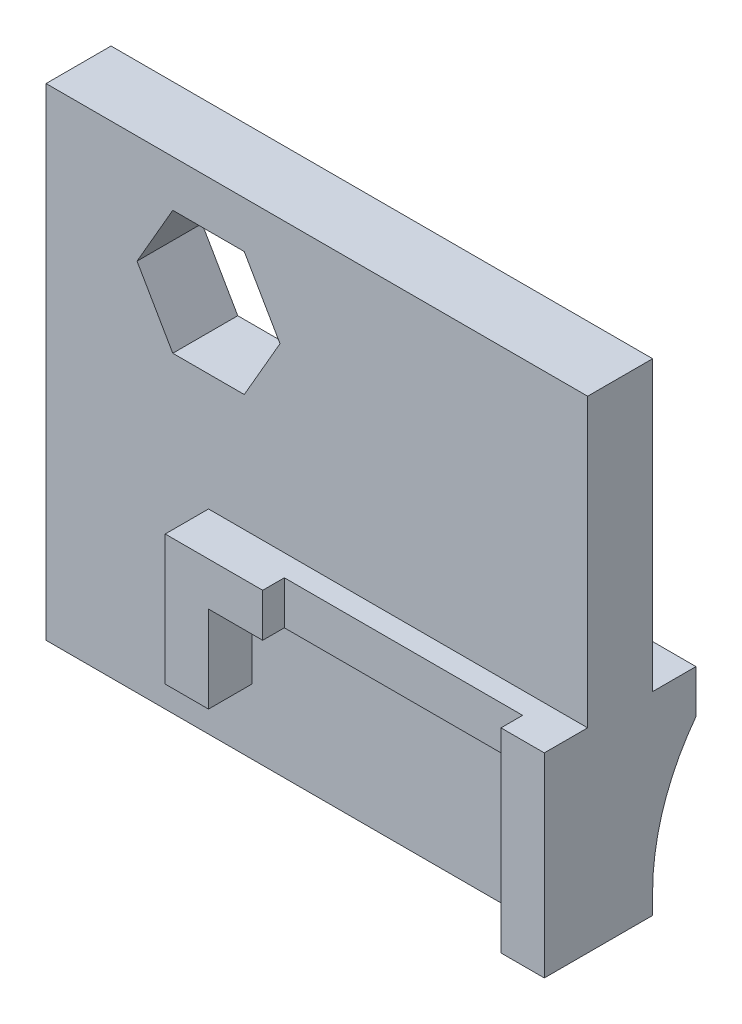
ISO-10303-21;
HEADER;
FILE_DESCRIPTION(('STEP AP214'),'2;1');
FILE_NAME('part.step','',(''),(''),'','','');
FILE_SCHEMA(('AUTOMOTIVE_DESIGN { 1 0 10303 214 1 1 1 1 }'));
ENDSEC;
DATA;
#1=APPLICATION_CONTEXT('core data for automotive mechanical design processes');
#2=APPLICATION_PROTOCOL_DEFINITION('international standard','automotive_design',2000,#1);
#3=PRODUCT_CONTEXT('',#1,'mechanical');
#4=PRODUCT('Part','Part','',(#3));
#5=PRODUCT_RELATED_PRODUCT_CATEGORY('part','',(#4));
#6=PRODUCT_DEFINITION_FORMATION('','',#4);
#7=PRODUCT_DEFINITION_CONTEXT('part definition',#1,'design');
#8=PRODUCT_DEFINITION('design','',#6,#7);
#9=PRODUCT_DEFINITION_SHAPE('','',#8);
#10=(LENGTH_UNIT() NAMED_UNIT(*) SI_UNIT(.MILLI.,.METRE.));
#11=(NAMED_UNIT(*) PLANE_ANGLE_UNIT() SI_UNIT($,.RADIAN.));
#12=(NAMED_UNIT(*) SI_UNIT($,.STERADIAN.) SOLID_ANGLE_UNIT());
#13=UNCERTAINTY_MEASURE_WITH_UNIT(LENGTH_MEASURE(1.E-05),#10,'distance_accuracy_value','');
#14=(GEOMETRIC_REPRESENTATION_CONTEXT(3) GLOBAL_UNCERTAINTY_ASSIGNED_CONTEXT((#13)) GLOBAL_UNIT_ASSIGNED_CONTEXT((#10,
#11,#12)) REPRESENTATION_CONTEXT('',''));
#15=CARTESIAN_POINT('',(0.,0.,0.));
#16=DIRECTION('',(0.,0.,1.));
#17=DIRECTION('',(1.,0.,0.));
#18=AXIS2_PLACEMENT_3D('',#15,#16,#17);
#19=CARTESIAN_POINT('',(0.,0.,5.));
#20=DIRECTION('',(0.,0.,1.));
#21=DIRECTION('',(1.,0.,0.));
#22=AXIS2_PLACEMENT_3D('',#19,#20,#21);
#23=PLANE('',#22);
#24=DIRECTION('',(0.,-1.,0.));
#25=VECTOR('',#24,1.);
#26=CARTESIAN_POINT('',(4.50000000000001,-8.25788383248865,5.));
#27=LINE('',#26,#25);
#28=CARTESIAN_POINT('',(4.50000000000001,-8.25788383248865,5.));
#29=VERTEX_POINT('',#28);
#30=CARTESIAN_POINT('',(4.50000000000001,-10.2578838324887,5.));
#31=VERTEX_POINT('',#30);
#32=EDGE_CURVE('E205',#29,#31,#27,.T.);
#33=ORIENTED_EDGE('',*,*,#32,.F.);
#34=DIRECTION('',(-1.,0.,0.));
#35=VECTOR('',#34,1.);
#36=CARTESIAN_POINT('',(0.,-8.25788383248865,5.));
#37=LINE('',#36,#35);
#38=CARTESIAN_POINT('',(0.,-8.25788383248865,5.));
#39=VERTEX_POINT('',#38);
#40=EDGE_CURVE('E268',#29,#39,#37,.T.);
#41=ORIENTED_EDGE('',*,*,#40,.T.);
#42=DIRECTION('',(0.,-1.,0.));
#43=VECTOR('',#42,1.);
#44=CARTESIAN_POINT('',(0.,-8.25788383248865,5.));
#45=LINE('',#44,#43);
#46=CARTESIAN_POINT('',(0.,-14.2578838324887,5.));
#47=VERTEX_POINT('',#46);
#48=EDGE_CURVE('E244',#39,#47,#45,.T.);
#49=ORIENTED_EDGE('',*,*,#48,.T.);
#50=DIRECTION('',(1.,0.,0.));
#51=VECTOR('',#50,1.);
#52=CARTESIAN_POINT('',(0.,-14.2578838324887,5.));
#53=LINE('',#52,#51);
#54=CARTESIAN_POINT('',(2.00000000000001,-14.2578838324887,5.));
#55=VERTEX_POINT('',#54);
#56=EDGE_CURVE('E248',#47,#55,#53,.T.);
#57=ORIENTED_EDGE('',*,*,#56,.T.);
#58=DIRECTION('',(0.,1.,0.));
#59=VECTOR('',#58,1.);
#60=CARTESIAN_POINT('',(2.00000000000001,-10.2578838324887,5.));
#61=LINE('',#60,#59);
#62=CARTESIAN_POINT('',(2.00000000000001,-10.2578838324887,5.));
#63=VERTEX_POINT('',#62);
#64=EDGE_CURVE('E252',#55,#63,#61,.T.);
#65=ORIENTED_EDGE('',*,*,#64,.T.);
#66=DIRECTION('',(1.,0.,0.));
#67=VECTOR('',#66,1.);
#68=CARTESIAN_POINT('',(2.00000000000001,-10.2578838324887,5.));
#69=LINE('',#68,#67);
#70=EDGE_CURVE('E255',#63,#31,#69,.T.);
#71=ORIENTED_EDGE('',*,*,#70,.T.);
#72=EDGE_LOOP('',(#33,#41,#49,#57,#65,#71));
#73=FACE_BOUND('',#72,.T.);
#74=ADVANCED_FACE('F39',(#73),#23,.T.);
#75=CARTESIAN_POINT('',(0.,0.,0.));
#76=DIRECTION('',(0.,0.,1.));
#77=DIRECTION('',(1.,0.,0.));
#78=AXIS2_PLACEMENT_3D('',#75,#76,#77);
#79=PLANE('',#78);
#80=DIRECTION('',(0.,-1.,0.));
#81=VECTOR('',#80,1.);
#82=CARTESIAN_POINT('',(-7.5,5.,0.));
#83=LINE('',#82,#81);
#84=CARTESIAN_POINT('',(-7.5,-16.3078838324886,0.));
#85=VERTEX_POINT('',#84);
#86=CARTESIAN_POINT('',(-7.5,-17.2578838324886,0.));
#87=VERTEX_POINT('',#86);
#88=EDGE_CURVE('E410',#85,#87,#83,.T.);
#89=ORIENTED_EDGE('',*,*,#88,.F.);
#90=DIRECTION('',(1.,0.,0.));
#91=VECTOR('',#90,1.);
#92=CARTESIAN_POINT('',(0.,-16.3078838324886,0.));
#93=LINE('',#92,#91);
#94=CARTESIAN_POINT('',(17.5,-16.3078838324886,0.));
#95=VERTEX_POINT('',#94);
#96=EDGE_CURVE('E61',#85,#95,#93,.T.);
#97=ORIENTED_EDGE('',*,*,#96,.T.);
#98=DIRECTION('',(0.,1.,0.));
#99=VECTOR('',#98,1.);
#100=CARTESIAN_POINT('',(17.5,5.,0.));
#101=LINE('',#100,#99);
#102=CARTESIAN_POINT('',(17.5,-17.2578838324886,0.));
#103=VERTEX_POINT('',#102);
#104=EDGE_CURVE('E434',#103,#95,#101,.T.);
#105=ORIENTED_EDGE('',*,*,#104,.F.);
#106=DIRECTION('',(1.,0.,0.));
#107=VECTOR('',#106,1.);
#108=CARTESIAN_POINT('',(-7.5,-17.2578838324886,0.));
#109=LINE('',#108,#107);
#110=EDGE_CURVE('E430',#87,#103,#109,.T.);
#111=ORIENTED_EDGE('',*,*,#110,.F.);
#112=EDGE_LOOP('',(#89,#97,#105,#111));
#113=FACE_BOUND('',#112,.T.);
#114=ADVANCED_FACE('F504',(#113),#79,.F.);
#115=DIRECTION('',(1.,0.,0.));
#116=VECTOR('',#115,1.);
#117=CARTESIAN_POINT('',(-1.65,-2.85788383248865,0.));
#118=LINE('',#117,#116);
#119=CARTESIAN_POINT('',(-1.65,-2.85788383248865,0.));
#120=VERTEX_POINT('',#119);
#121=CARTESIAN_POINT('',(1.65,-2.85788383248865,0.));
#122=VERTEX_POINT('',#121);
#123=EDGE_CURVE('E347',#120,#122,#118,.T.);
#124=ORIENTED_EDGE('',*,*,#123,.T.);
#125=DIRECTION('',(0.5,0.866025403784439,0.));
#126=VECTOR('',#125,1.);
#127=CARTESIAN_POINT('',(1.65,-2.85788383248865,0.));
#128=LINE('',#127,#126);
#129=CARTESIAN_POINT('',(3.3,0.,0.));
#130=VERTEX_POINT('',#129);
#131=EDGE_CURVE('E372',#122,#130,#128,.T.);
#132=ORIENTED_EDGE('',*,*,#131,.T.);
#133=DIRECTION('',(-0.5,0.866025403784438,0.));
#134=VECTOR('',#133,1.);
#135=CARTESIAN_POINT('',(3.3,0.,0.));
#136=LINE('',#135,#134);
#137=CARTESIAN_POINT('',(1.65,2.85788383248865,0.));
#138=VERTEX_POINT('',#137);
#139=EDGE_CURVE('E376',#130,#138,#136,.T.);
#140=ORIENTED_EDGE('',*,*,#139,.T.);
#141=DIRECTION('',(-1.,0.,0.));
#142=VECTOR('',#141,1.);
#143=CARTESIAN_POINT('',(1.65,2.85788383248865,0.));
#144=LINE('',#143,#142);
#145=CARTESIAN_POINT('',(-1.65,2.85788383248865,0.));
#146=VERTEX_POINT('',#145);
#147=EDGE_CURVE('E380',#138,#146,#144,.T.);
#148=ORIENTED_EDGE('',*,*,#147,.T.);
#149=DIRECTION('',(-0.5,-0.866025403784439,0.));
#150=VECTOR('',#149,1.);
#151=CARTESIAN_POINT('',(-1.65,2.85788383248865,0.));
#152=LINE('',#151,#150);
#153=CARTESIAN_POINT('',(-3.3,0.,0.));
#154=VERTEX_POINT('',#153);
#155=EDGE_CURVE('E384',#146,#154,#152,.T.);
#156=ORIENTED_EDGE('',*,*,#155,.T.);
#157=DIRECTION('',(0.5,-0.866025403784439,0.));
#158=VECTOR('',#157,1.);
#159=CARTESIAN_POINT('',(-3.3,0.,0.));
#160=LINE('',#159,#158);
#161=EDGE_CURVE('E352',#154,#120,#160,.T.);
#162=ORIENTED_EDGE('',*,*,#161,.T.);
#163=EDGE_LOOP('',(#124,#132,#140,#148,#156,#162));
#164=FACE_BOUND('',#163,.T.);
#165=DIRECTION('',(1.,0.,0.));
#166=VECTOR('',#165,1.);
#167=CARTESIAN_POINT('',(-7.5,-8.30788383248865,0.));
#168=LINE('',#167,#166);
#169=CARTESIAN_POINT('',(-7.5,-8.30788383248865,0.));
#170=VERTEX_POINT('',#169);
#171=CARTESIAN_POINT('',(17.5,-8.30788383248865,0.));
#172=VERTEX_POINT('',#171);
#173=EDGE_CURVE('E320',#170,#172,#168,.T.);
#174=ORIENTED_EDGE('',*,*,#173,.F.);
#175=CARTESIAN_POINT('',(-7.5,5.,0.));
#176=VERTEX_POINT('',#175);
#177=EDGE_CURVE('E426',#176,#170,#83,.T.);
#178=ORIENTED_EDGE('',*,*,#177,.F.);
#179=DIRECTION('',(-1.,0.,0.));
#180=VECTOR('',#179,1.);
#181=CARTESIAN_POINT('',(-7.5,5.,0.));
#182=LINE('',#181,#180);
#183=CARTESIAN_POINT('',(17.5,5.,0.));
#184=VERTEX_POINT('',#183);
#185=EDGE_CURVE('E416',#184,#176,#182,.T.);
#186=ORIENTED_EDGE('',*,*,#185,.F.);
#187=EDGE_CURVE('E433',#172,#184,#101,.T.);
#188=ORIENTED_EDGE('',*,*,#187,.F.);
#189=EDGE_LOOP('',(#174,#178,#186,#188));
#190=FACE_BOUND('',#189,.T.);
#191=ADVANCED_FACE('F516',(#164,#190),#79,.F.);
#192=CARTESIAN_POINT('',(0.,0.,3.));
#193=DIRECTION('',(0.,0.,1.));
#194=DIRECTION('',(1.,0.,0.));
#195=AXIS2_PLACEMENT_3D('',#192,#193,#194);
#196=PLANE('',#195);
#197=DIRECTION('',(-1.,0.,0.));
#198=VECTOR('',#197,1.);
#199=CARTESIAN_POINT('',(0.,-8.25788383248865,3.));
#200=LINE('',#199,#198);
#201=CARTESIAN_POINT('',(17.5,-8.25788383248865,3.));
#202=VERTEX_POINT('',#201);
#203=CARTESIAN_POINT('',(0.,-8.25788383248865,3.));
#204=VERTEX_POINT('',#203);
#205=EDGE_CURVE('E249',#202,#204,#200,.T.);
#206=ORIENTED_EDGE('',*,*,#205,.F.);
#207=DIRECTION('',(0.,1.,0.));
#208=VECTOR('',#207,1.);
#209=CARTESIAN_POINT('',(17.5,5.,3.));
#210=LINE('',#209,#208);
#211=CARTESIAN_POINT('',(17.5,5.,3.));
#212=VERTEX_POINT('',#211);
#213=EDGE_CURVE('E419',#202,#212,#210,.T.);
#214=ORIENTED_EDGE('',*,*,#213,.T.);
#215=DIRECTION('',(-1.,0.,0.));
#216=VECTOR('',#215,1.);
#217=CARTESIAN_POINT('',(-7.5,5.,3.));
#218=LINE('',#217,#216);
#219=CARTESIAN_POINT('',(-7.5,5.,3.));
#220=VERTEX_POINT('',#219);
#221=EDGE_CURVE('E422',#212,#220,#218,.T.);
#222=ORIENTED_EDGE('',*,*,#221,.T.);
#223=DIRECTION('',(0.,-1.,0.));
#224=VECTOR('',#223,1.);
#225=CARTESIAN_POINT('',(-7.5,5.,3.));
#226=LINE('',#225,#224);
#227=CARTESIAN_POINT('',(-7.5,-17.2578838324886,3.));
#228=VERTEX_POINT('',#227);
#229=EDGE_CURVE('E411',#220,#228,#226,.T.);
#230=ORIENTED_EDGE('',*,*,#229,.T.);
#231=DIRECTION('',(1.,0.,0.));
#232=VECTOR('',#231,1.);
#233=CARTESIAN_POINT('',(-7.5,-17.2578838324886,3.));
#234=LINE('',#233,#232);
#235=CARTESIAN_POINT('',(15.5,-17.2578838324886,3.));
#236=VERTEX_POINT('',#235);
#237=EDGE_CURVE('E415',#228,#236,#234,.T.);
#238=ORIENTED_EDGE('',*,*,#237,.T.);
#239=DIRECTION('',(0.,-1.,0.));
#240=VECTOR('',#239,1.);
#241=CARTESIAN_POINT('',(15.5,-10.2578838324887,3.));
#242=LINE('',#241,#240);
#243=CARTESIAN_POINT('',(15.5,-10.2578838324887,3.));
#244=VERTEX_POINT('',#243);
#245=EDGE_CURVE('E288',#244,#236,#242,.T.);
#246=ORIENTED_EDGE('',*,*,#245,.F.);
#247=DIRECTION('',(1.,0.,0.));
#248=VECTOR('',#247,1.);
#249=CARTESIAN_POINT('',(2.00000000000001,-10.2578838324887,3.));
#250=LINE('',#249,#248);
#251=CARTESIAN_POINT('',(2.00000000000001,-10.2578838324887,3.));
#252=VERTEX_POINT('',#251);
#253=EDGE_CURVE('E285',#252,#244,#250,.T.);
#254=ORIENTED_EDGE('',*,*,#253,.F.);
#255=DIRECTION('',(0.,1.,0.));
#256=VECTOR('',#255,1.);
#257=CARTESIAN_POINT('',(2.00000000000001,-10.2578838324887,3.));
#258=LINE('',#257,#256);
#259=CARTESIAN_POINT('',(2.00000000000001,-14.2578838324887,3.));
#260=VERTEX_POINT('',#259);
#261=EDGE_CURVE('E281',#260,#252,#258,.T.);
#262=ORIENTED_EDGE('',*,*,#261,.F.);
#263=DIRECTION('',(1.,0.,0.));
#264=VECTOR('',#263,1.);
#265=CARTESIAN_POINT('',(0.,-14.2578838324887,3.));
#266=LINE('',#265,#264);
#267=CARTESIAN_POINT('',(0.,-14.2578838324887,3.));
#268=VERTEX_POINT('',#267);
#269=EDGE_CURVE('E277',#268,#260,#266,.T.);
#270=ORIENTED_EDGE('',*,*,#269,.F.);
#271=DIRECTION('',(0.,-1.,0.));
#272=VECTOR('',#271,1.);
#273=CARTESIAN_POINT('',(0.,-8.25788383248865,3.));
#274=LINE('',#273,#272);
#275=EDGE_CURVE('E240',#204,#268,#274,.T.);
#276=ORIENTED_EDGE('',*,*,#275,.F.);
#277=EDGE_LOOP('',(#206,#214,#222,#230,#238,#246,#254,#262,#270,#276));
#278=FACE_BOUND('',#277,.T.);
#279=DIRECTION('',(0.5,0.866025403784439,0.));
#280=VECTOR('',#279,1.);
#281=CARTESIAN_POINT('',(1.65,-2.85788383248865,3.));
#282=LINE('',#281,#280);
#283=CARTESIAN_POINT('',(1.65,-2.85788383248865,3.));
#284=VERTEX_POINT('',#283);
#285=CARTESIAN_POINT('',(3.3,0.,3.));
#286=VERTEX_POINT('',#285);
#287=EDGE_CURVE('E351',#284,#286,#282,.T.);
#288=ORIENTED_EDGE('',*,*,#287,.F.);
#289=DIRECTION('',(1.,0.,0.));
#290=VECTOR('',#289,1.);
#291=CARTESIAN_POINT('',(-1.65,-2.85788383248865,3.));
#292=LINE('',#291,#290);
#293=CARTESIAN_POINT('',(-1.65,-2.85788383248865,3.));
#294=VERTEX_POINT('',#293);
#295=EDGE_CURVE('E348',#294,#284,#292,.T.);
#296=ORIENTED_EDGE('',*,*,#295,.F.);
#297=DIRECTION('',(0.5,-0.866025403784439,0.));
#298=VECTOR('',#297,1.);
#299=CARTESIAN_POINT('',(-3.3,0.,3.));
#300=LINE('',#299,#298);
#301=CARTESIAN_POINT('',(-3.3,0.,3.));
#302=VERTEX_POINT('',#301);
#303=EDGE_CURVE('E365',#302,#294,#300,.T.);
#304=ORIENTED_EDGE('',*,*,#303,.F.);
#305=DIRECTION('',(-0.5,-0.866025403784439,0.));
#306=VECTOR('',#305,1.);
#307=CARTESIAN_POINT('',(-1.65,2.85788383248865,3.));
#308=LINE('',#307,#306);
#309=CARTESIAN_POINT('',(-1.65,2.85788383248865,3.));
#310=VERTEX_POINT('',#309);
#311=EDGE_CURVE('E361',#310,#302,#308,.T.);
#312=ORIENTED_EDGE('',*,*,#311,.F.);
#313=DIRECTION('',(-1.,0.,0.));
#314=VECTOR('',#313,1.);
#315=CARTESIAN_POINT('',(1.65,2.85788383248865,3.));
#316=LINE('',#315,#314);
#317=CARTESIAN_POINT('',(1.65,2.85788383248865,3.));
#318=VERTEX_POINT('',#317);
#319=EDGE_CURVE('E358',#318,#310,#316,.T.);
#320=ORIENTED_EDGE('',*,*,#319,.F.);
#321=DIRECTION('',(-0.5,0.866025403784438,0.));
#322=VECTOR('',#321,1.);
#323=CARTESIAN_POINT('',(3.3,0.,3.));
#324=LINE('',#323,#322);
#325=EDGE_CURVE('E355',#286,#318,#324,.T.);
#326=ORIENTED_EDGE('',*,*,#325,.F.);
#327=EDGE_LOOP('',(#288,#296,#304,#312,#320,#326));
#328=FACE_BOUND('',#327,.T.);
#329=ADVANCED_FACE('F477',(#278,#328),#196,.T.);
#330=CARTESIAN_POINT('',(-7.5,5.,3.));
#331=DIRECTION('',(1.,0.,0.));
#332=DIRECTION('',(0.,1.,0.));
#333=AXIS2_PLACEMENT_3D('',#330,#331,#332);
#334=PLANE('',#333);
#335=ORIENTED_EDGE('',*,*,#177,.T.);
#336=DIRECTION('',(0.,0.,1.));
#337=VECTOR('',#336,1.);
#338=CARTESIAN_POINT('',(-7.5,-8.30788383248865,-2.));
#339=LINE('',#338,#337);
#340=CARTESIAN_POINT('',(-7.5,-8.30788383248865,-2.));
#341=VERTEX_POINT('',#340);
#342=EDGE_CURVE('E343',#341,#170,#339,.T.);
#343=ORIENTED_EDGE('',*,*,#342,.F.);
#344=DIRECTION('',(0.,1.,0.));
#345=VECTOR('',#344,1.);
#346=CARTESIAN_POINT('',(-7.5,-8.30788383248865,-2.));
#347=LINE('',#346,#345);
#348=CARTESIAN_POINT('',(-7.5,-10.3078838324886,-2.));
#349=VERTEX_POINT('',#348);
#350=EDGE_CURVE('E321',#349,#341,#347,.T.);
#351=ORIENTED_EDGE('',*,*,#350,.F.);
#352=CARTESIAN_POINT('',(-7.5,-16.3078838324886,-10.));
#353=DIRECTION('',(1.,0.,0.));
#354=DIRECTION('',(0.,1.,0.));
#355=AXIS2_PLACEMENT_3D('',#352,#353,#354);
#356=CIRCLE('',#355,10.);
#357=EDGE_CURVE('E48',#349,#85,#356,.T.);
#358=ORIENTED_EDGE('',*,*,#357,.T.);
#359=ORIENTED_EDGE('',*,*,#88,.T.);
#360=DIRECTION('',(0.,0.,-1.));
#361=VECTOR('',#360,1.);
#362=CARTESIAN_POINT('',(-7.5,-17.2578838324886,3.));
#363=LINE('',#362,#361);
#364=EDGE_CURVE('E450',#228,#87,#363,.T.);
#365=ORIENTED_EDGE('',*,*,#364,.F.);
#366=ORIENTED_EDGE('',*,*,#229,.F.);
#367=DIRECTION('',(0.,0.,-1.));
#368=VECTOR('',#367,1.);
#369=CARTESIAN_POINT('',(-7.5,5.,3.));
#370=LINE('',#369,#368);
#371=EDGE_CURVE('E425',#220,#176,#370,.T.);
#372=ORIENTED_EDGE('',*,*,#371,.T.);
#373=EDGE_LOOP('',(#335,#343,#351,#358,#359,#365,#366,#372));
#374=FACE_BOUND('',#373,.T.);
#375=ADVANCED_FACE('F502',(#374),#334,.F.);
#376=CARTESIAN_POINT('',(-7.5,-17.2578838324886,3.));
#377=DIRECTION('',(0.,1.,0.));
#378=DIRECTION('',(0.,0.,1.));
#379=AXIS2_PLACEMENT_3D('',#376,#377,#378);
#380=PLANE('',#379);
#381=ORIENTED_EDGE('',*,*,#110,.T.);
#382=DIRECTION('',(0.,0.,-1.));
#383=VECTOR('',#382,1.);
#384=CARTESIAN_POINT('',(17.5,-17.2578838324886,3.));
#385=LINE('',#384,#383);
#386=CARTESIAN_POINT('',(17.5,-17.2578838324886,5.));
#387=VERTEX_POINT('',#386);
#388=EDGE_CURVE('E446',#387,#103,#385,.T.);
#389=ORIENTED_EDGE('',*,*,#388,.F.);
#390=DIRECTION('',(1.,0.,0.));
#391=VECTOR('',#390,1.);
#392=CARTESIAN_POINT('',(15.5,-17.2578838324886,5.));
#393=LINE('',#392,#391);
#394=CARTESIAN_POINT('',(15.5,-17.2578838324886,5.));
#395=VERTEX_POINT('',#394);
#396=EDGE_CURVE('E261',#395,#387,#393,.T.);
#397=ORIENTED_EDGE('',*,*,#396,.F.);
#398=DIRECTION('',(0.,0.,-1.));
#399=VECTOR('',#398,1.);
#400=CARTESIAN_POINT('',(15.5,-17.2578838324886,5.));
#401=LINE('',#400,#399);
#402=EDGE_CURVE('E302',#395,#236,#401,.T.);
#403=ORIENTED_EDGE('',*,*,#402,.T.);
#404=ORIENTED_EDGE('',*,*,#237,.F.);
#405=ORIENTED_EDGE('',*,*,#364,.T.);
#406=EDGE_LOOP('',(#381,#389,#397,#403,#404,#405));
#407=FACE_BOUND('',#406,.T.);
#408=ADVANCED_FACE('F484',(#407),#380,.F.);
#409=CARTESIAN_POINT('',(17.5,5.,3.));
#410=DIRECTION('',(-1.,0.,0.));
#411=DIRECTION('',(0.,-1.,0.));
#412=AXIS2_PLACEMENT_3D('',#409,#410,#411);
#413=PLANE('',#412);
#414=ORIENTED_EDGE('',*,*,#104,.T.);
#415=CARTESIAN_POINT('',(17.5,-16.3078838324886,-10.));
#416=DIRECTION('',(-1.,0.,0.));
#417=DIRECTION('',(0.,-1.,0.));
#418=AXIS2_PLACEMENT_3D('',#415,#416,#417);
#419=CIRCLE('',#418,10.);
#420=CARTESIAN_POINT('',(17.5,-10.3078838324886,-2.));
#421=VERTEX_POINT('',#420);
#422=EDGE_CURVE('E11',#95,#421,#419,.T.);
#423=ORIENTED_EDGE('',*,*,#422,.T.);
#424=DIRECTION('',(0.,-1.,0.));
#425=VECTOR('',#424,1.);
#426=CARTESIAN_POINT('',(17.5,-8.30788383248865,-2.));
#427=LINE('',#426,#425);
#428=CARTESIAN_POINT('',(17.5,-8.30788383248865,-2.));
#429=VERTEX_POINT('',#428);
#430=EDGE_CURVE('E328',#429,#421,#427,.T.);
#431=ORIENTED_EDGE('',*,*,#430,.F.);
#432=DIRECTION('',(0.,0.,1.));
#433=VECTOR('',#432,1.);
#434=CARTESIAN_POINT('',(17.5,-8.30788383248865,-2.));
#435=LINE('',#434,#433);
#436=EDGE_CURVE('E336',#429,#172,#435,.T.);
#437=ORIENTED_EDGE('',*,*,#436,.T.);
#438=ORIENTED_EDGE('',*,*,#187,.T.);
#439=DIRECTION('',(0.,0.,-1.));
#440=VECTOR('',#439,1.);
#441=CARTESIAN_POINT('',(17.5,5.,3.));
#442=LINE('',#441,#440);
#443=EDGE_CURVE('E442',#212,#184,#442,.T.);
#444=ORIENTED_EDGE('',*,*,#443,.F.);
#445=ORIENTED_EDGE('',*,*,#213,.F.);
#446=DIRECTION('',(0.,0.,-1.));
#447=VECTOR('',#446,1.);
#448=CARTESIAN_POINT('',(17.5,-8.25788383248865,5.));
#449=LINE('',#448,#447);
#450=CARTESIAN_POINT('',(17.5,-8.25788383248865,5.));
#451=VERTEX_POINT('',#450);
#452=EDGE_CURVE('E298',#451,#202,#449,.T.);
#453=ORIENTED_EDGE('',*,*,#452,.F.);
#454=DIRECTION('',(0.,1.,0.));
#455=VECTOR('',#454,1.);
#456=CARTESIAN_POINT('',(17.5,-8.25788383248865,5.));
#457=LINE('',#456,#455);
#458=EDGE_CURVE('E265',#387,#451,#457,.T.);
#459=ORIENTED_EDGE('',*,*,#458,.F.);
#460=ORIENTED_EDGE('',*,*,#388,.T.);
#461=EDGE_LOOP('',(#414,#423,#431,#437,#438,#444,#445,#453,#459,#460));
#462=FACE_BOUND('',#461,.T.);
#463=ADVANCED_FACE('F490',(#462),#413,.F.);
#464=CARTESIAN_POINT('',(-7.5,5.,3.));
#465=DIRECTION('',(0.,-1.,0.));
#466=DIRECTION('',(0.,0.,-1.));
#467=AXIS2_PLACEMENT_3D('',#464,#465,#466);
#468=PLANE('',#467);
#469=ORIENTED_EDGE('',*,*,#185,.T.);
#470=ORIENTED_EDGE('',*,*,#371,.F.);
#471=ORIENTED_EDGE('',*,*,#221,.F.);
#472=ORIENTED_EDGE('',*,*,#443,.T.);
#473=EDGE_LOOP('',(#469,#470,#471,#472));
#474=FACE_BOUND('',#473,.T.);
#475=ADVANCED_FACE('F499',(#474),#468,.F.);
#476=CARTESIAN_POINT('',(-1.65,-2.85788383248865,3.));
#477=DIRECTION('',(0.,1.,0.));
#478=DIRECTION('',(0.,0.,1.));
#479=AXIS2_PLACEMENT_3D('',#476,#477,#478);
#480=PLANE('',#479);
#481=ORIENTED_EDGE('',*,*,#123,.F.);
#482=DIRECTION('',(0.,0.,-1.));
#483=VECTOR('',#482,1.);
#484=CARTESIAN_POINT('',(-1.65,-2.85788383248865,3.));
#485=LINE('',#484,#483);
#486=EDGE_CURVE('E368',#294,#120,#485,.T.);
#487=ORIENTED_EDGE('',*,*,#486,.F.);
#488=ORIENTED_EDGE('',*,*,#295,.T.);
#489=DIRECTION('',(0.,0.,-1.));
#490=VECTOR('',#489,1.);
#491=CARTESIAN_POINT('',(1.65,-2.85788383248865,3.));
#492=LINE('',#491,#490);
#493=EDGE_CURVE('E406',#284,#122,#492,.T.);
#494=ORIENTED_EDGE('',*,*,#493,.T.);
#495=EDGE_LOOP('',(#481,#487,#488,#494));
#496=FACE_BOUND('',#495,.T.);
#497=ADVANCED_FACE('F573',(#496),#480,.T.);
#498=CARTESIAN_POINT('',(1.65,-2.85788383248865,3.));
#499=DIRECTION('',(-0.866025403784438,0.5,0.));
#500=DIRECTION('',(-0.5,-0.866025403784439,0.));
#501=AXIS2_PLACEMENT_3D('',#498,#499,#500);
#502=PLANE('',#501);
#503=ORIENTED_EDGE('',*,*,#131,.F.);
#504=ORIENTED_EDGE('',*,*,#493,.F.);
#505=ORIENTED_EDGE('',*,*,#287,.T.);
#506=DIRECTION('',(0.,0.,-1.));
#507=VECTOR('',#506,1.);
#508=CARTESIAN_POINT('',(3.3,0.,3.));
#509=LINE('',#508,#507);
#510=EDGE_CURVE('E403',#286,#130,#509,.T.);
#511=ORIENTED_EDGE('',*,*,#510,.T.);
#512=EDGE_LOOP('',(#503,#504,#505,#511));
#513=FACE_BOUND('',#512,.T.);
#514=ADVANCED_FACE('F569',(#513),#502,.T.);
#515=CARTESIAN_POINT('',(3.3,0.,3.));
#516=DIRECTION('',(-0.866025403784438,-0.5,0.));
#517=DIRECTION('',(0.5,-0.866025403784439,0.));
#518=AXIS2_PLACEMENT_3D('',#515,#516,#517);
#519=PLANE('',#518);
#520=ORIENTED_EDGE('',*,*,#139,.F.);
#521=ORIENTED_EDGE('',*,*,#510,.F.);
#522=ORIENTED_EDGE('',*,*,#325,.T.);
#523=DIRECTION('',(0.,0.,-1.));
#524=VECTOR('',#523,1.);
#525=CARTESIAN_POINT('',(1.65,2.85788383248865,3.));
#526=LINE('',#525,#524);
#527=EDGE_CURVE('E400',#318,#138,#526,.T.);
#528=ORIENTED_EDGE('',*,*,#527,.T.);
#529=EDGE_LOOP('',(#520,#521,#522,#528));
#530=FACE_BOUND('',#529,.T.);
#531=ADVANCED_FACE('F565',(#530),#519,.T.);
#532=CARTESIAN_POINT('',(1.65,2.85788383248865,3.));
#533=DIRECTION('',(0.,-1.,0.));
#534=DIRECTION('',(1.,0.,0.));
#535=AXIS2_PLACEMENT_3D('',#532,#533,#534);
#536=PLANE('',#535);
#537=ORIENTED_EDGE('',*,*,#147,.F.);
#538=ORIENTED_EDGE('',*,*,#527,.F.);
#539=ORIENTED_EDGE('',*,*,#319,.T.);
#540=DIRECTION('',(0.,0.,-1.));
#541=VECTOR('',#540,1.);
#542=CARTESIAN_POINT('',(-1.65,2.85788383248865,3.));
#543=LINE('',#542,#541);
#544=EDGE_CURVE('E397',#310,#146,#543,.T.);
#545=ORIENTED_EDGE('',*,*,#544,.T.);
#546=EDGE_LOOP('',(#537,#538,#539,#545));
#547=FACE_BOUND('',#546,.T.);
#548=ADVANCED_FACE('F561',(#547),#536,.T.);
#549=CARTESIAN_POINT('',(-1.65,2.85788383248865,3.));
#550=DIRECTION('',(0.866025403784439,-0.5,0.));
#551=DIRECTION('',(0.5,0.866025403784439,0.));
#552=AXIS2_PLACEMENT_3D('',#549,#550,#551);
#553=PLANE('',#552);
#554=ORIENTED_EDGE('',*,*,#155,.F.);
#555=ORIENTED_EDGE('',*,*,#544,.F.);
#556=ORIENTED_EDGE('',*,*,#311,.T.);
#557=DIRECTION('',(0.,0.,-1.));
#558=VECTOR('',#557,1.);
#559=CARTESIAN_POINT('',(-3.3,0.,3.));
#560=LINE('',#559,#558);
#561=EDGE_CURVE('E394',#302,#154,#560,.T.);
#562=ORIENTED_EDGE('',*,*,#561,.T.);
#563=EDGE_LOOP('',(#554,#555,#556,#562));
#564=FACE_BOUND('',#563,.T.);
#565=ADVANCED_FACE('F557',(#564),#553,.T.);
#566=CARTESIAN_POINT('',(-3.3,0.,3.));
#567=DIRECTION('',(0.866025403784439,0.5,0.));
#568=DIRECTION('',(-0.5,0.866025403784439,0.));
#569=AXIS2_PLACEMENT_3D('',#566,#567,#568);
#570=PLANE('',#569);
#571=ORIENTED_EDGE('',*,*,#161,.F.);
#572=ORIENTED_EDGE('',*,*,#561,.F.);
#573=ORIENTED_EDGE('',*,*,#303,.T.);
#574=ORIENTED_EDGE('',*,*,#486,.T.);
#575=EDGE_LOOP('',(#571,#572,#573,#574));
#576=FACE_BOUND('',#575,.T.);
#577=ADVANCED_FACE('F554',(#576),#570,.T.);
#578=CARTESIAN_POINT('',(-7.5,-8.30788383248865,-2.));
#579=DIRECTION('',(0.,-1.,0.));
#580=DIRECTION('',(1.,0.,0.));
#581=AXIS2_PLACEMENT_3D('',#578,#579,#580);
#582=PLANE('',#581);
#583=ORIENTED_EDGE('',*,*,#173,.T.);
#584=ORIENTED_EDGE('',*,*,#436,.F.);
#585=DIRECTION('',(1.,0.,0.));
#586=VECTOR('',#585,1.);
#587=CARTESIAN_POINT('',(-7.5,-8.30788383248865,-2.));
#588=LINE('',#587,#586);
#589=EDGE_CURVE('E325',#341,#429,#588,.T.);
#590=ORIENTED_EDGE('',*,*,#589,.F.);
#591=ORIENTED_EDGE('',*,*,#342,.T.);
#592=EDGE_LOOP('',(#583,#584,#590,#591));
#593=FACE_BOUND('',#592,.T.);
#594=ADVANCED_FACE('F513',(#593),#582,.F.);
#595=CARTESIAN_POINT('',(0.,0.,-2.));
#596=DIRECTION('',(0.,0.,1.));
#597=DIRECTION('',(1.,0.,0.));
#598=AXIS2_PLACEMENT_3D('',#595,#596,#597);
#599=PLANE('',#598);
#600=ORIENTED_EDGE('',*,*,#350,.T.);
#601=ORIENTED_EDGE('',*,*,#589,.T.);
#602=ORIENTED_EDGE('',*,*,#430,.T.);
#603=DIRECTION('',(-1.,0.,0.));
#604=VECTOR('',#603,1.);
#605=CARTESIAN_POINT('',(-7.5,-10.3078838324886,-2.));
#606=LINE('',#605,#604);
#607=EDGE_CURVE('E332',#421,#349,#606,.T.);
#608=ORIENTED_EDGE('',*,*,#607,.T.);
#609=EDGE_LOOP('',(#600,#601,#602,#608));
#610=FACE_BOUND('',#609,.T.);
#611=ADVANCED_FACE('F510',(#610),#599,.F.);
#612=CARTESIAN_POINT('',(0.,-8.25788383248865,5.));
#613=DIRECTION('',(1.,0.,0.));
#614=DIRECTION('',(0.,1.,0.));
#615=AXIS2_PLACEMENT_3D('',#612,#613,#614);
#616=PLANE('',#615);
#617=ORIENTED_EDGE('',*,*,#275,.T.);
#618=DIRECTION('',(0.,0.,-1.));
#619=VECTOR('',#618,1.);
#620=CARTESIAN_POINT('',(0.,-14.2578838324887,5.));
#621=LINE('',#620,#619);
#622=EDGE_CURVE('E316',#47,#268,#621,.T.);
#623=ORIENTED_EDGE('',*,*,#622,.F.);
#624=ORIENTED_EDGE('',*,*,#48,.F.);
#625=DIRECTION('',(0.,0.,-1.));
#626=VECTOR('',#625,1.);
#627=CARTESIAN_POINT('',(0.,-8.25788383248865,5.));
#628=LINE('',#627,#626);
#629=EDGE_CURVE('E273',#39,#204,#628,.T.);
#630=ORIENTED_EDGE('',*,*,#629,.T.);
#631=EDGE_LOOP('',(#617,#623,#624,#630));
#632=FACE_BOUND('',#631,.T.);
#633=ADVANCED_FACE('F467',(#632),#616,.F.);
#634=CARTESIAN_POINT('',(0.,-14.2578838324887,5.));
#635=DIRECTION('',(0.,1.,0.));
#636=DIRECTION('',(0.,0.,1.));
#637=AXIS2_PLACEMENT_3D('',#634,#635,#636);
#638=PLANE('',#637);
#639=ORIENTED_EDGE('',*,*,#269,.T.);
#640=DIRECTION('',(0.,0.,-1.));
#641=VECTOR('',#640,1.);
#642=CARTESIAN_POINT('',(2.00000000000001,-14.2578838324887,5.));
#643=LINE('',#642,#641);
#644=EDGE_CURVE('E312',#55,#260,#643,.T.);
#645=ORIENTED_EDGE('',*,*,#644,.F.);
#646=ORIENTED_EDGE('',*,*,#56,.F.);
#647=ORIENTED_EDGE('',*,*,#622,.T.);
#648=EDGE_LOOP('',(#639,#645,#646,#647));
#649=FACE_BOUND('',#648,.T.);
#650=ADVANCED_FACE('F469',(#649),#638,.F.);
#651=CARTESIAN_POINT('',(2.00000000000001,-10.2578838324887,5.));
#652=DIRECTION('',(-1.,0.,0.));
#653=DIRECTION('',(0.,-1.,0.));
#654=AXIS2_PLACEMENT_3D('',#651,#652,#653);
#655=PLANE('',#654);
#656=ORIENTED_EDGE('',*,*,#261,.T.);
#657=DIRECTION('',(0.,0.,-1.));
#658=VECTOR('',#657,1.);
#659=CARTESIAN_POINT('',(2.00000000000001,-10.2578838324887,5.));
#660=LINE('',#659,#658);
#661=EDGE_CURVE('E308',#63,#252,#660,.T.);
#662=ORIENTED_EDGE('',*,*,#661,.F.);
#663=ORIENTED_EDGE('',*,*,#64,.F.);
#664=ORIENTED_EDGE('',*,*,#644,.T.);
#665=EDGE_LOOP('',(#656,#662,#663,#664));
#666=FACE_BOUND('',#665,.T.);
#667=ADVANCED_FACE('F474',(#666),#655,.F.);
#668=CARTESIAN_POINT('',(2.00000000000001,-10.2578838324887,5.));
#669=DIRECTION('',(0.,1.,0.));
#670=DIRECTION('',(0.,0.,1.));
#671=AXIS2_PLACEMENT_3D('',#668,#669,#670);
#672=PLANE('',#671);
#673=DIRECTION('',(1.,0.,0.));
#674=VECTOR('',#673,1.);
#675=CARTESIAN_POINT('',(4.50000000000001,-10.2578838324887,4.));
#676=LINE('',#675,#674);
#677=CARTESIAN_POINT('',(4.50000000000001,-10.2578838324887,4.));
#678=VERTEX_POINT('',#677);
#679=CARTESIAN_POINT('',(15.5,-10.2578838324887,4.));
#680=VERTEX_POINT('',#679);
#681=EDGE_CURVE('E218',#678,#680,#676,.T.);
#682=ORIENTED_EDGE('',*,*,#681,.F.);
#683=DIRECTION('',(0.,0.,1.));
#684=VECTOR('',#683,1.);
#685=CARTESIAN_POINT('',(4.50000000000001,-10.2578838324887,4.));
#686=LINE('',#685,#684);
#687=EDGE_CURVE('E199',#678,#31,#686,.T.);
#688=ORIENTED_EDGE('',*,*,#687,.T.);
#689=ORIENTED_EDGE('',*,*,#70,.F.);
#690=ORIENTED_EDGE('',*,*,#661,.T.);
#691=ORIENTED_EDGE('',*,*,#253,.T.);
#692=DIRECTION('',(0.,0.,-1.));
#693=VECTOR('',#692,1.);
#694=CARTESIAN_POINT('',(15.5,-10.2578838324887,5.));
#695=LINE('',#694,#693);
#696=EDGE_CURVE('E226',#680,#244,#695,.T.);
#697=ORIENTED_EDGE('',*,*,#696,.F.);
#698=EDGE_LOOP('',(#682,#688,#689,#690,#691,#697));
#699=FACE_BOUND('',#698,.T.);
#700=ADVANCED_FACE('F224',(#699),#672,.F.);
#701=CARTESIAN_POINT('',(15.5,-10.2578838324887,5.));
#702=DIRECTION('',(1.,0.,0.));
#703=DIRECTION('',(0.,0.,-1.));
#704=AXIS2_PLACEMENT_3D('',#701,#702,#703);
#705=PLANE('',#704);
#706=ORIENTED_EDGE('',*,*,#245,.T.);
#707=ORIENTED_EDGE('',*,*,#402,.F.);
#708=DIRECTION('',(0.,-1.,0.));
#709=VECTOR('',#708,1.);
#710=CARTESIAN_POINT('',(15.5,-10.2578838324887,5.));
#711=LINE('',#710,#709);
#712=CARTESIAN_POINT('',(15.5,-8.25788383248865,5.));
#713=VERTEX_POINT('',#712);
#714=EDGE_CURVE('E258',#713,#395,#711,.T.);
#715=ORIENTED_EDGE('',*,*,#714,.F.);
#716=DIRECTION('',(0.,0.,1.));
#717=VECTOR('',#716,1.);
#718=CARTESIAN_POINT('',(15.5,-8.25788383248865,4.));
#719=LINE('',#718,#717);
#720=CARTESIAN_POINT('',(15.5,-8.25788383248865,4.));
#721=VERTEX_POINT('',#720);
#722=EDGE_CURVE('E211',#721,#713,#719,.T.);
#723=ORIENTED_EDGE('',*,*,#722,.F.);
#724=DIRECTION('',(0.,1.,0.));
#725=VECTOR('',#724,1.);
#726=CARTESIAN_POINT('',(15.5,-8.25788383248865,4.));
#727=LINE('',#726,#725);
#728=EDGE_CURVE('E228',#680,#721,#727,.T.);
#729=ORIENTED_EDGE('',*,*,#728,.F.);
#730=ORIENTED_EDGE('',*,*,#696,.T.);
#731=EDGE_LOOP('',(#706,#707,#715,#723,#729,#730));
#732=FACE_BOUND('',#731,.T.);
#733=ADVANCED_FACE('F481',(#732),#705,.F.);
#734=CARTESIAN_POINT('',(0.,-8.25788383248865,5.));
#735=DIRECTION('',(0.,-1.,0.));
#736=DIRECTION('',(0.,0.,-1.));
#737=AXIS2_PLACEMENT_3D('',#734,#735,#736);
#738=PLANE('',#737);
#739=ORIENTED_EDGE('',*,*,#40,.F.);
#740=DIRECTION('',(0.,0.,1.));
#741=VECTOR('',#740,1.);
#742=CARTESIAN_POINT('',(4.50000000000001,-8.25788383248865,4.));
#743=LINE('',#742,#741);
#744=CARTESIAN_POINT('',(4.50000000000001,-8.25788383248865,4.));
#745=VERTEX_POINT('',#744);
#746=EDGE_CURVE('E237',#745,#29,#743,.T.);
#747=ORIENTED_EDGE('',*,*,#746,.F.);
#748=DIRECTION('',(-1.,0.,0.));
#749=VECTOR('',#748,1.);
#750=CARTESIAN_POINT('',(4.50000000000001,-8.25788383248865,4.));
#751=LINE('',#750,#749);
#752=EDGE_CURVE('E212',#721,#745,#751,.T.);
#753=ORIENTED_EDGE('',*,*,#752,.F.);
#754=ORIENTED_EDGE('',*,*,#722,.T.);
#755=EDGE_CURVE('E269',#451,#713,#37,.T.);
#756=ORIENTED_EDGE('',*,*,#755,.F.);
#757=ORIENTED_EDGE('',*,*,#452,.T.);
#758=ORIENTED_EDGE('',*,*,#205,.T.);
#759=ORIENTED_EDGE('',*,*,#629,.F.);
#760=EDGE_LOOP('',(#739,#747,#753,#754,#756,#757,#758,#759));
#761=FACE_BOUND('',#760,.T.);
#762=ADVANCED_FACE('F465',(#761),#738,.F.);
#763=ORIENTED_EDGE('',*,*,#755,.T.);
#764=ORIENTED_EDGE('',*,*,#714,.T.);
#765=ORIENTED_EDGE('',*,*,#396,.T.);
#766=ORIENTED_EDGE('',*,*,#458,.T.);
#767=EDGE_LOOP('',(#763,#764,#765,#766));
#768=FACE_BOUND('',#767,.T.);
#769=ADVANCED_FACE('F487',(#768),#23,.T.);
#770=CARTESIAN_POINT('',(4.50000000000001,-8.25788383248865,4.));
#771=DIRECTION('',(-1.,0.,0.));
#772=DIRECTION('',(0.,0.,1.));
#773=AXIS2_PLACEMENT_3D('',#770,#771,#772);
#774=PLANE('',#773);
#775=ORIENTED_EDGE('',*,*,#32,.T.);
#776=ORIENTED_EDGE('',*,*,#687,.F.);
#777=DIRECTION('',(0.,-1.,0.));
#778=VECTOR('',#777,1.);
#779=CARTESIAN_POINT('',(4.50000000000001,-8.25788383248865,4.));
#780=LINE('',#779,#778);
#781=EDGE_CURVE('E202',#745,#678,#780,.T.);
#782=ORIENTED_EDGE('',*,*,#781,.F.);
#783=ORIENTED_EDGE('',*,*,#746,.T.);
#784=EDGE_LOOP('',(#775,#776,#782,#783));
#785=FACE_BOUND('',#784,.T.);
#786=ADVANCED_FACE('F201',(#785),#774,.F.);
#787=CARTESIAN_POINT('',(0.,0.,4.));
#788=DIRECTION('',(0.,0.,1.));
#789=DIRECTION('',(1.,0.,0.));
#790=AXIS2_PLACEMENT_3D('',#787,#788,#789);
#791=PLANE('',#790);
#792=ORIENTED_EDGE('',*,*,#781,.T.);
#793=ORIENTED_EDGE('',*,*,#681,.T.);
#794=ORIENTED_EDGE('',*,*,#728,.T.);
#795=ORIENTED_EDGE('',*,*,#752,.T.);
#796=EDGE_LOOP('',(#792,#793,#794,#795));
#797=FACE_BOUND('',#796,.T.);
#798=ADVANCED_FACE('F216',(#797),#791,.T.);
#799=CARTESIAN_POINT('',(-7.5,-16.3078838324886,-10.));
#800=DIRECTION('',(1.,0.,0.));
#801=DIRECTION('',(0.,1.,0.));
#802=AXIS2_PLACEMENT_3D('',#799,#800,#801);
#803=CYLINDRICAL_SURFACE('',#802,10.);
#804=ORIENTED_EDGE('',*,*,#422,.F.);
#805=ORIENTED_EDGE('',*,*,#96,.F.);
#806=ORIENTED_EDGE('',*,*,#357,.F.);
#807=ORIENTED_EDGE('',*,*,#607,.F.);
#808=EDGE_LOOP('',(#804,#805,#806,#807));
#809=FACE_BOUND('',#808,.T.);
#810=ADVANCED_FACE('F41',(#809),#803,.F.);
#811=CLOSED_SHELL('',(#74,#114,#191,#329,#375,#408,#463,#475,#497,#514,#531,#548,#565,#577,#594,
#611,#633,#650,#667,#700,#733,#762,#769,#786,#798,#810));
#812=MANIFOLD_SOLID_BREP('B2',#811);
#813=ADVANCED_BREP_SHAPE_REPRESENTATION('',(#18,#812),#14);
#814=SHAPE_DEFINITION_REPRESENTATION(#9,#813);
ENDSEC;
END-ISO-10303-21;
